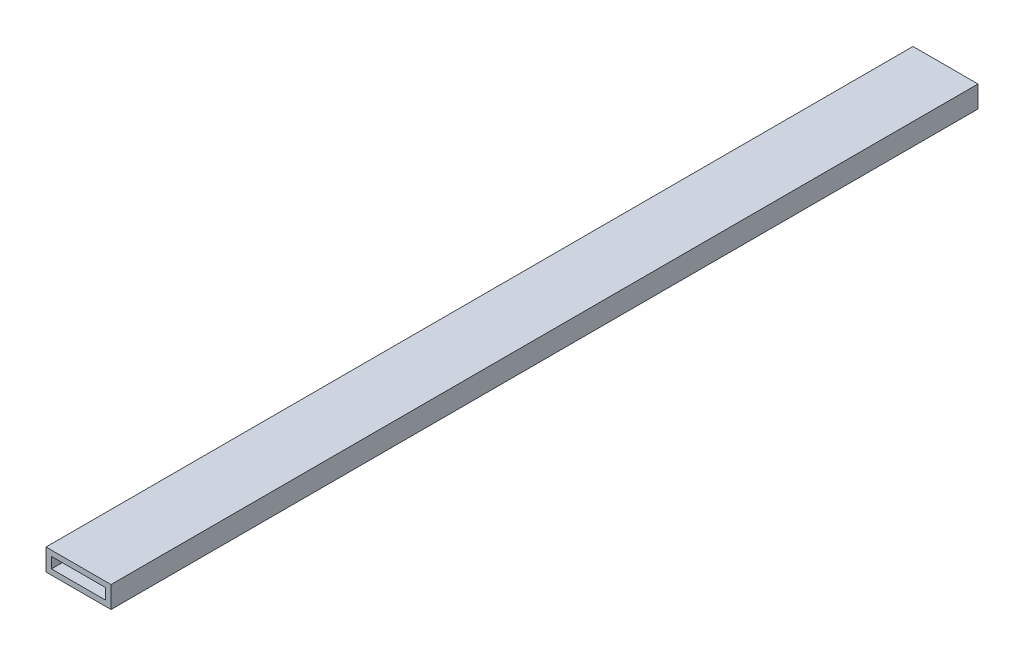
ISO-10303-21;
HEADER;
FILE_DESCRIPTION(('STEP AP214'),'2;1');
FILE_NAME('part.step','',(''),(''),'','','');
FILE_SCHEMA(('AUTOMOTIVE_DESIGN { 1 0 10303 214 1 1 1 1 }'));
ENDSEC;
DATA;
#1=APPLICATION_CONTEXT('core data for automotive mechanical design processes');
#2=APPLICATION_PROTOCOL_DEFINITION('international standard','automotive_design',2000,#1);
#3=PRODUCT_CONTEXT('',#1,'mechanical');
#4=PRODUCT('Part','Part','',(#3));
#5=PRODUCT_RELATED_PRODUCT_CATEGORY('part','',(#4));
#6=PRODUCT_DEFINITION_FORMATION('','',#4);
#7=PRODUCT_DEFINITION_CONTEXT('part definition',#1,'design');
#8=PRODUCT_DEFINITION('design','',#6,#7);
#9=PRODUCT_DEFINITION_SHAPE('','',#8);
#10=(LENGTH_UNIT() NAMED_UNIT(*) SI_UNIT(.MILLI.,.METRE.));
#11=(NAMED_UNIT(*) PLANE_ANGLE_UNIT() SI_UNIT($,.RADIAN.));
#12=(NAMED_UNIT(*) SI_UNIT($,.STERADIAN.) SOLID_ANGLE_UNIT());
#13=UNCERTAINTY_MEASURE_WITH_UNIT(LENGTH_MEASURE(1.E-05),#10,'distance_accuracy_value','');
#14=(GEOMETRIC_REPRESENTATION_CONTEXT(3) GLOBAL_UNCERTAINTY_ASSIGNED_CONTEXT((#13)) GLOBAL_UNIT_ASSIGNED_CONTEXT((#10,
#11,#12)) REPRESENTATION_CONTEXT('',''));
#15=CARTESIAN_POINT('',(0.,0.,0.));
#16=DIRECTION('',(0.,0.,1.));
#17=DIRECTION('',(1.,0.,0.));
#18=AXIS2_PLACEMENT_3D('',#15,#16,#17);
#19=CARTESIAN_POINT('',(0.,0.,200.));
#20=DIRECTION('',(0.,0.,-1.));
#21=DIRECTION('',(-1.,0.,0.));
#22=AXIS2_PLACEMENT_3D('',#19,#20,#21);
#23=PLANE('',#22);
#24=DIRECTION('',(0.,1.,0.));
#25=VECTOR('',#24,1.);
#26=CARTESIAN_POINT('',(15.,-5.,200.));
#27=LINE('',#26,#25);
#28=CARTESIAN_POINT('',(15.,-5.,200.));
#29=VERTEX_POINT('',#28);
#30=CARTESIAN_POINT('',(15.,5.,200.));
#31=VERTEX_POINT('',#30);
#32=EDGE_CURVE('E142',#29,#31,#27,.T.);
#33=ORIENTED_EDGE('',*,*,#32,.T.);
#34=DIRECTION('',(-1.,0.,0.));
#35=VECTOR('',#34,1.);
#36=CARTESIAN_POINT('',(-15.,5.,200.));
#37=LINE('',#36,#35);
#38=CARTESIAN_POINT('',(-15.,5.,200.));
#39=VERTEX_POINT('',#38);
#40=EDGE_CURVE('E145',#31,#39,#37,.T.);
#41=ORIENTED_EDGE('',*,*,#40,.T.);
#42=DIRECTION('',(0.,-1.,0.));
#43=VECTOR('',#42,1.);
#44=CARTESIAN_POINT('',(-15.,-5.,200.));
#45=LINE('',#44,#43);
#46=CARTESIAN_POINT('',(-15.,-5.,200.));
#47=VERTEX_POINT('',#46);
#48=EDGE_CURVE('E148',#39,#47,#45,.T.);
#49=ORIENTED_EDGE('',*,*,#48,.T.);
#50=DIRECTION('',(1.,0.,0.));
#51=VECTOR('',#50,1.);
#52=CARTESIAN_POINT('',(-15.,-5.,200.));
#53=LINE('',#52,#51);
#54=EDGE_CURVE('E150',#47,#29,#53,.T.);
#55=ORIENTED_EDGE('',*,*,#54,.T.);
#56=EDGE_LOOP('',(#33,#41,#49,#55));
#57=FACE_BOUND('',#56,.T.);
#58=DIRECTION('',(1.,0.,0.));
#59=VECTOR('',#58,1.);
#60=CARTESIAN_POINT('',(-12.5,-2.5,200.));
#61=LINE('',#60,#59);
#62=CARTESIAN_POINT('',(-12.5,-2.5,200.));
#63=VERTEX_POINT('',#62);
#64=CARTESIAN_POINT('',(12.5,-2.5,200.));
#65=VERTEX_POINT('',#64);
#66=EDGE_CURVE('E106',#63,#65,#61,.T.);
#67=ORIENTED_EDGE('',*,*,#66,.F.);
#68=DIRECTION('',(0.,-1.,0.));
#69=VECTOR('',#68,1.);
#70=CARTESIAN_POINT('',(-12.5,-2.5,200.));
#71=LINE('',#70,#69);
#72=CARTESIAN_POINT('',(-12.5,2.5,200.));
#73=VERTEX_POINT('',#72);
#74=EDGE_CURVE('E128',#73,#63,#71,.T.);
#75=ORIENTED_EDGE('',*,*,#74,.F.);
#76=DIRECTION('',(-1.,0.,0.));
#77=VECTOR('',#76,1.);
#78=CARTESIAN_POINT('',(-12.5,2.5,200.));
#79=LINE('',#78,#77);
#80=CARTESIAN_POINT('',(12.5,2.5,200.));
#81=VERTEX_POINT('',#80);
#82=EDGE_CURVE('E126',#81,#73,#79,.T.);
#83=ORIENTED_EDGE('',*,*,#82,.F.);
#84=DIRECTION('',(0.,1.,0.));
#85=VECTOR('',#84,1.);
#86=CARTESIAN_POINT('',(12.5,-2.5,200.));
#87=LINE('',#86,#85);
#88=EDGE_CURVE('E114',#65,#81,#87,.T.);
#89=ORIENTED_EDGE('',*,*,#88,.F.);
#90=EDGE_LOOP('',(#67,#75,#83,#89));
#91=FACE_BOUND('',#90,.T.);
#92=ADVANCED_FACE('F41',(#57,#91),#23,.F.);
#93=CARTESIAN_POINT('',(0.,0.,-200.));
#94=DIRECTION('',(0.,0.,-1.));
#95=DIRECTION('',(-1.,0.,0.));
#96=AXIS2_PLACEMENT_3D('',#93,#94,#95);
#97=PLANE('',#96);
#98=DIRECTION('',(0.,1.,0.));
#99=VECTOR('',#98,1.);
#100=CARTESIAN_POINT('',(15.,-5.,-200.));
#101=LINE('',#100,#99);
#102=CARTESIAN_POINT('',(15.,-5.,-200.));
#103=VERTEX_POINT('',#102);
#104=CARTESIAN_POINT('',(15.,5.,-200.));
#105=VERTEX_POINT('',#104);
#106=EDGE_CURVE('E122',#103,#105,#101,.T.);
#107=ORIENTED_EDGE('',*,*,#106,.F.);
#108=DIRECTION('',(1.,0.,0.));
#109=VECTOR('',#108,1.);
#110=CARTESIAN_POINT('',(-15.,-5.,-200.));
#111=LINE('',#110,#109);
#112=CARTESIAN_POINT('',(-15.,-5.,-200.));
#113=VERTEX_POINT('',#112);
#114=EDGE_CURVE('E146',#113,#103,#111,.T.);
#115=ORIENTED_EDGE('',*,*,#114,.F.);
#116=DIRECTION('',(0.,-1.,0.));
#117=VECTOR('',#116,1.);
#118=CARTESIAN_POINT('',(-15.,-5.,-200.));
#119=LINE('',#118,#117);
#120=CARTESIAN_POINT('',(-15.,5.,-200.));
#121=VERTEX_POINT('',#120);
#122=EDGE_CURVE('E157',#121,#113,#119,.T.);
#123=ORIENTED_EDGE('',*,*,#122,.F.);
#124=DIRECTION('',(-1.,0.,0.));
#125=VECTOR('',#124,1.);
#126=CARTESIAN_POINT('',(-15.,5.,-200.));
#127=LINE('',#126,#125);
#128=EDGE_CURVE('E155',#105,#121,#127,.T.);
#129=ORIENTED_EDGE('',*,*,#128,.F.);
#130=EDGE_LOOP('',(#107,#115,#123,#129));
#131=FACE_BOUND('',#130,.T.);
#132=DIRECTION('',(0.,-1.,0.));
#133=VECTOR('',#132,1.);
#134=CARTESIAN_POINT('',(-12.5,-2.5,-200.));
#135=LINE('',#134,#133);
#136=CARTESIAN_POINT('',(-12.5,2.5,-200.));
#137=VERTEX_POINT('',#136);
#138=CARTESIAN_POINT('',(-12.5,-2.5,-200.));
#139=VERTEX_POINT('',#138);
#140=EDGE_CURVE('E115',#137,#139,#135,.T.);
#141=ORIENTED_EDGE('',*,*,#140,.T.);
#142=DIRECTION('',(1.,0.,0.));
#143=VECTOR('',#142,1.);
#144=CARTESIAN_POINT('',(-12.5,-2.5,-200.));
#145=LINE('',#144,#143);
#146=CARTESIAN_POINT('',(12.5,-2.5,-200.));
#147=VERTEX_POINT('',#146);
#148=EDGE_CURVE('E64',#139,#147,#145,.T.);
#149=ORIENTED_EDGE('',*,*,#148,.T.);
#150=DIRECTION('',(0.,1.,0.));
#151=VECTOR('',#150,1.);
#152=CARTESIAN_POINT('',(12.5,-2.5,-200.));
#153=LINE('',#152,#151);
#154=CARTESIAN_POINT('',(12.5,2.5,-200.));
#155=VERTEX_POINT('',#154);
#156=EDGE_CURVE('E121',#147,#155,#153,.T.);
#157=ORIENTED_EDGE('',*,*,#156,.T.);
#158=DIRECTION('',(-1.,0.,0.));
#159=VECTOR('',#158,1.);
#160=CARTESIAN_POINT('',(-12.5,2.5,-200.));
#161=LINE('',#160,#159);
#162=EDGE_CURVE('E134',#155,#137,#161,.T.);
#163=ORIENTED_EDGE('',*,*,#162,.T.);
#164=EDGE_LOOP('',(#141,#149,#157,#163));
#165=FACE_BOUND('',#164,.T.);
#166=ADVANCED_FACE('F175',(#131,#165),#97,.T.);
#167=CARTESIAN_POINT('',(15.,-5.,200.));
#168=DIRECTION('',(-1.,0.,0.));
#169=DIRECTION('',(0.,0.,1.));
#170=AXIS2_PLACEMENT_3D('',#167,#168,#169);
#171=PLANE('',#170);
#172=ORIENTED_EDGE('',*,*,#106,.T.);
#173=DIRECTION('',(0.,0.,-1.));
#174=VECTOR('',#173,1.);
#175=CARTESIAN_POINT('',(15.,5.,200.));
#176=LINE('',#175,#174);
#177=EDGE_CURVE('E11',#31,#105,#176,.T.);
#178=ORIENTED_EDGE('',*,*,#177,.F.);
#179=ORIENTED_EDGE('',*,*,#32,.F.);
#180=DIRECTION('',(0.,0.,-1.));
#181=VECTOR('',#180,1.);
#182=CARTESIAN_POINT('',(15.,-5.,200.));
#183=LINE('',#182,#181);
#184=EDGE_CURVE('E152',#29,#103,#183,.T.);
#185=ORIENTED_EDGE('',*,*,#184,.T.);
#186=EDGE_LOOP('',(#172,#178,#179,#185));
#187=FACE_BOUND('',#186,.T.);
#188=ADVANCED_FACE('F43',(#187),#171,.F.);
#189=CARTESIAN_POINT('',(-15.,5.,200.));
#190=DIRECTION('',(0.,-1.,0.));
#191=DIRECTION('',(0.,0.,-1.));
#192=AXIS2_PLACEMENT_3D('',#189,#190,#191);
#193=PLANE('',#192);
#194=ORIENTED_EDGE('',*,*,#128,.T.);
#195=DIRECTION('',(0.,0.,-1.));
#196=VECTOR('',#195,1.);
#197=CARTESIAN_POINT('',(-15.,5.,200.));
#198=LINE('',#197,#196);
#199=EDGE_CURVE('E49',#39,#121,#198,.T.);
#200=ORIENTED_EDGE('',*,*,#199,.F.);
#201=ORIENTED_EDGE('',*,*,#40,.F.);
#202=ORIENTED_EDGE('',*,*,#177,.T.);
#203=EDGE_LOOP('',(#194,#200,#201,#202));
#204=FACE_BOUND('',#203,.T.);
#205=ADVANCED_FACE('F185',(#204),#193,.F.);
#206=CARTESIAN_POINT('',(-15.,-5.,200.));
#207=DIRECTION('',(1.,0.,0.));
#208=DIRECTION('',(0.,0.,-1.));
#209=AXIS2_PLACEMENT_3D('',#206,#207,#208);
#210=PLANE('',#209);
#211=ORIENTED_EDGE('',*,*,#122,.T.);
#212=DIRECTION('',(0.,0.,-1.));
#213=VECTOR('',#212,1.);
#214=CARTESIAN_POINT('',(-15.,-5.,200.));
#215=LINE('',#214,#213);
#216=EDGE_CURVE('E162',#47,#113,#215,.T.);
#217=ORIENTED_EDGE('',*,*,#216,.F.);
#218=ORIENTED_EDGE('',*,*,#48,.F.);
#219=ORIENTED_EDGE('',*,*,#199,.T.);
#220=EDGE_LOOP('',(#211,#217,#218,#219));
#221=FACE_BOUND('',#220,.T.);
#222=ADVANCED_FACE('F169',(#221),#210,.F.);
#223=CARTESIAN_POINT('',(-15.,-5.,200.));
#224=DIRECTION('',(0.,1.,0.));
#225=DIRECTION('',(0.,0.,1.));
#226=AXIS2_PLACEMENT_3D('',#223,#224,#225);
#227=PLANE('',#226);
#228=ORIENTED_EDGE('',*,*,#114,.T.);
#229=ORIENTED_EDGE('',*,*,#184,.F.);
#230=ORIENTED_EDGE('',*,*,#54,.F.);
#231=ORIENTED_EDGE('',*,*,#216,.T.);
#232=EDGE_LOOP('',(#228,#229,#230,#231));
#233=FACE_BOUND('',#232,.T.);
#234=ADVANCED_FACE('F179',(#233),#227,.F.);
#235=CARTESIAN_POINT('',(-12.5,-2.5,200.));
#236=DIRECTION('',(0.,1.,0.));
#237=DIRECTION('',(0.,0.,1.));
#238=AXIS2_PLACEMENT_3D('',#235,#236,#237);
#239=PLANE('',#238);
#240=ORIENTED_EDGE('',*,*,#148,.F.);
#241=DIRECTION('',(0.,0.,-1.));
#242=VECTOR('',#241,1.);
#243=CARTESIAN_POINT('',(-12.5,-2.5,200.));
#244=LINE('',#243,#242);
#245=EDGE_CURVE('E110',#63,#139,#244,.T.);
#246=ORIENTED_EDGE('',*,*,#245,.F.);
#247=ORIENTED_EDGE('',*,*,#66,.T.);
#248=DIRECTION('',(0.,0.,-1.));
#249=VECTOR('',#248,1.);
#250=CARTESIAN_POINT('',(12.5,-2.5,200.));
#251=LINE('',#250,#249);
#252=EDGE_CURVE('E109',#65,#147,#251,.T.);
#253=ORIENTED_EDGE('',*,*,#252,.T.);
#254=EDGE_LOOP('',(#240,#246,#247,#253));
#255=FACE_BOUND('',#254,.T.);
#256=ADVANCED_FACE('F108',(#255),#239,.T.);
#257=CARTESIAN_POINT('',(12.5,-2.5,200.));
#258=DIRECTION('',(-1.,0.,0.));
#259=DIRECTION('',(0.,0.,1.));
#260=AXIS2_PLACEMENT_3D('',#257,#258,#259);
#261=PLANE('',#260);
#262=ORIENTED_EDGE('',*,*,#156,.F.);
#263=ORIENTED_EDGE('',*,*,#252,.F.);
#264=ORIENTED_EDGE('',*,*,#88,.T.);
#265=DIRECTION('',(0.,0.,-1.));
#266=VECTOR('',#265,1.);
#267=CARTESIAN_POINT('',(12.5,2.5,200.));
#268=LINE('',#267,#266);
#269=EDGE_CURVE('E123',#81,#155,#268,.T.);
#270=ORIENTED_EDGE('',*,*,#269,.T.);
#271=EDGE_LOOP('',(#262,#263,#264,#270));
#272=FACE_BOUND('',#271,.T.);
#273=ADVANCED_FACE('F118',(#272),#261,.T.);
#274=CARTESIAN_POINT('',(-12.5,2.5,200.));
#275=DIRECTION('',(0.,-1.,0.));
#276=DIRECTION('',(0.,0.,-1.));
#277=AXIS2_PLACEMENT_3D('',#274,#275,#276);
#278=PLANE('',#277);
#279=ORIENTED_EDGE('',*,*,#162,.F.);
#280=ORIENTED_EDGE('',*,*,#269,.F.);
#281=ORIENTED_EDGE('',*,*,#82,.T.);
#282=DIRECTION('',(0.,0.,-1.));
#283=VECTOR('',#282,1.);
#284=CARTESIAN_POINT('',(-12.5,2.5,200.));
#285=LINE('',#284,#283);
#286=EDGE_CURVE('E56',#73,#137,#285,.T.);
#287=ORIENTED_EDGE('',*,*,#286,.T.);
#288=EDGE_LOOP('',(#279,#280,#281,#287));
#289=FACE_BOUND('',#288,.T.);
#290=ADVANCED_FACE('F208',(#289),#278,.T.);
#291=CARTESIAN_POINT('',(-12.5,-2.5,200.));
#292=DIRECTION('',(1.,0.,0.));
#293=DIRECTION('',(0.,0.,-1.));
#294=AXIS2_PLACEMENT_3D('',#291,#292,#293);
#295=PLANE('',#294);
#296=ORIENTED_EDGE('',*,*,#140,.F.);
#297=ORIENTED_EDGE('',*,*,#286,.F.);
#298=ORIENTED_EDGE('',*,*,#74,.T.);
#299=ORIENTED_EDGE('',*,*,#245,.T.);
#300=EDGE_LOOP('',(#296,#297,#298,#299));
#301=FACE_BOUND('',#300,.T.);
#302=ADVANCED_FACE('F212',(#301),#295,.T.);
#303=CLOSED_SHELL('',(#92,#166,#188,#205,#222,#234,#256,#273,#290,#302));
#304=MANIFOLD_SOLID_BREP('B2',#303);
#305=ADVANCED_BREP_SHAPE_REPRESENTATION('',(#18,#304),#14);
#306=SHAPE_DEFINITION_REPRESENTATION(#9,#305);
ENDSEC;
END-ISO-10303-21;
